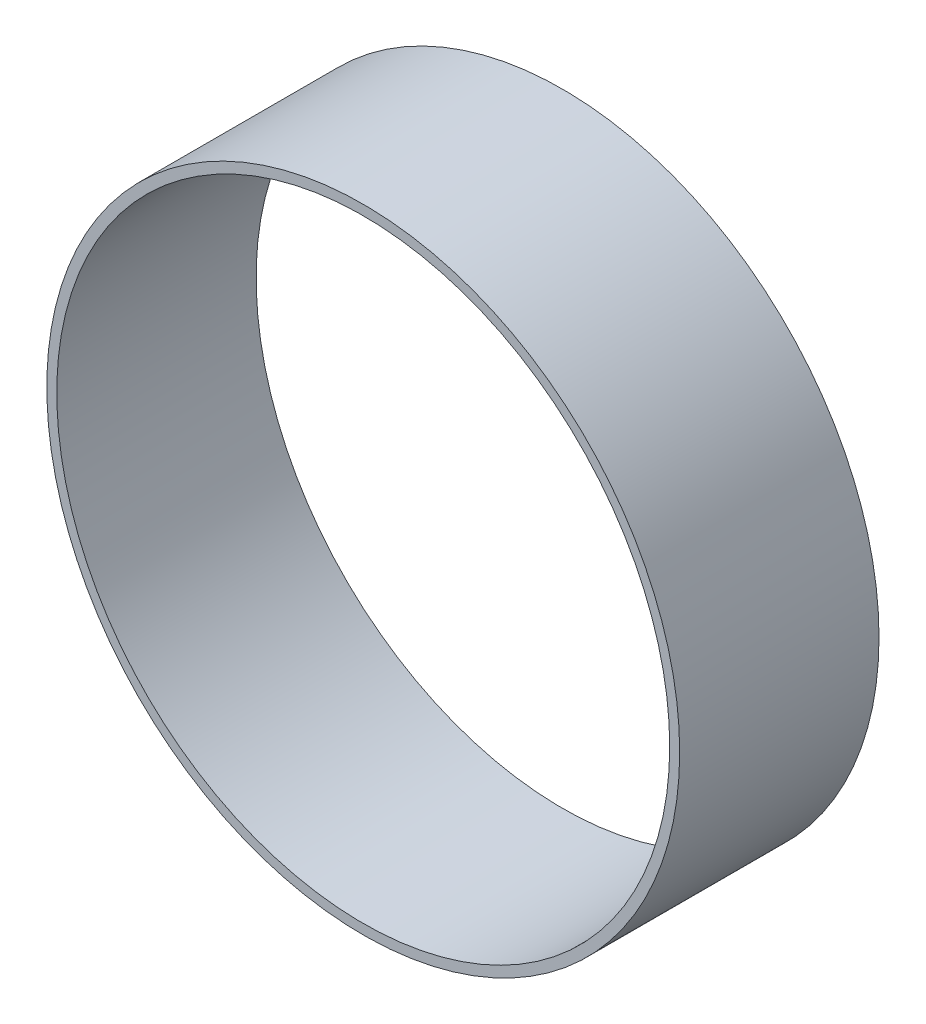
ISO-10303-21;
HEADER;
FILE_DESCRIPTION(('STEP AP214'),'2;1');
FILE_NAME('part.step','',(''),(''),'','','');
FILE_SCHEMA(('AUTOMOTIVE_DESIGN { 1 0 10303 214 1 1 1 1 }'));
ENDSEC;
DATA;
#1=APPLICATION_CONTEXT('core data for automotive mechanical design processes');
#2=APPLICATION_PROTOCOL_DEFINITION('international standard','automotive_design',2000,#1);
#3=PRODUCT_CONTEXT('',#1,'mechanical');
#4=PRODUCT('Part','Part','',(#3));
#5=PRODUCT_RELATED_PRODUCT_CATEGORY('part','',(#4));
#6=PRODUCT_DEFINITION_FORMATION('','',#4);
#7=PRODUCT_DEFINITION_CONTEXT('part definition',#1,'design');
#8=PRODUCT_DEFINITION('design','',#6,#7);
#9=PRODUCT_DEFINITION_SHAPE('','',#8);
#10=(LENGTH_UNIT() NAMED_UNIT(*) SI_UNIT(.MILLI.,.METRE.));
#11=(NAMED_UNIT(*) PLANE_ANGLE_UNIT() SI_UNIT($,.RADIAN.));
#12=(NAMED_UNIT(*) SI_UNIT($,.STERADIAN.) SOLID_ANGLE_UNIT());
#13=UNCERTAINTY_MEASURE_WITH_UNIT(LENGTH_MEASURE(1.E-05),#10,'distance_accuracy_value','');
#14=(GEOMETRIC_REPRESENTATION_CONTEXT(3) GLOBAL_UNCERTAINTY_ASSIGNED_CONTEXT((#13)) GLOBAL_UNIT_ASSIGNED_CONTEXT((#10,
#11,#12)) REPRESENTATION_CONTEXT('',''));
#15=CARTESIAN_POINT('',(0.,0.,0.));
#16=DIRECTION('',(0.,0.,1.));
#17=DIRECTION('',(1.,0.,0.));
#18=AXIS2_PLACEMENT_3D('',#15,#16,#17);
#19=CARTESIAN_POINT('',(0.,0.,40.));
#20=DIRECTION('',(0.,0.,1.));
#21=DIRECTION('',(1.,0.,0.));
#22=AXIS2_PLACEMENT_3D('',#19,#20,#21);
#23=PLANE('',#22);
#24=CARTESIAN_POINT('',(0.,0.,40.));
#25=DIRECTION('',(0.,0.,1.));
#26=DIRECTION('',(1.,0.,0.));
#27=AXIS2_PLACEMENT_3D('',#24,#25,#26);
#28=CIRCLE('',#27,63.5);
#29=CARTESIAN_POINT('',(63.5,0.,40.));
#30=VERTEX_POINT('',#29);
#31=EDGE_CURVE('E10',#30,#30,#28,.T.);
#32=ORIENTED_EDGE('',*,*,#31,.T.);
#33=EDGE_LOOP('',(#32));
#34=FACE_BOUND('',#33,.T.);
#35=CARTESIAN_POINT('',(0.,0.,40.));
#36=DIRECTION('',(0.,0.,1.));
#37=DIRECTION('',(1.,0.,0.));
#38=AXIS2_PLACEMENT_3D('',#35,#36,#37);
#39=CIRCLE('',#38,61.5);
#40=CARTESIAN_POINT('',(61.5,0.,40.));
#41=VERTEX_POINT('',#40);
#42=EDGE_CURVE('E44',#41,#41,#39,.T.);
#43=ORIENTED_EDGE('',*,*,#42,.F.);
#44=EDGE_LOOP('',(#43));
#45=FACE_BOUND('',#44,.T.);
#46=ADVANCED_FACE('F33',(#34,#45),#23,.T.);
#47=CARTESIAN_POINT('',(0.,0.,0.));
#48=DIRECTION('',(0.,0.,1.));
#49=DIRECTION('',(1.,0.,0.));
#50=AXIS2_PLACEMENT_3D('',#47,#48,#49);
#51=PLANE('',#50);
#52=CARTESIAN_POINT('',(0.,0.,0.));
#53=DIRECTION('',(0.,0.,1.));
#54=DIRECTION('',(1.,0.,0.));
#55=AXIS2_PLACEMENT_3D('',#52,#53,#54);
#56=CIRCLE('',#55,63.5);
#57=CARTESIAN_POINT('',(63.5,0.,0.));
#58=VERTEX_POINT('',#57);
#59=EDGE_CURVE('E37',#58,#58,#56,.T.);
#60=ORIENTED_EDGE('',*,*,#59,.F.);
#61=EDGE_LOOP('',(#60));
#62=FACE_BOUND('',#61,.T.);
#63=CARTESIAN_POINT('',(0.,0.,0.));
#64=DIRECTION('',(0.,0.,1.));
#65=DIRECTION('',(1.,0.,0.));
#66=AXIS2_PLACEMENT_3D('',#63,#64,#65);
#67=CIRCLE('',#66,61.5);
#68=CARTESIAN_POINT('',(61.5,0.,0.));
#69=VERTEX_POINT('',#68);
#70=EDGE_CURVE('E46',#69,#69,#67,.T.);
#71=ORIENTED_EDGE('',*,*,#70,.T.);
#72=EDGE_LOOP('',(#71));
#73=FACE_BOUND('',#72,.T.);
#74=ADVANCED_FACE('F56',(#62,#73),#51,.F.);
#75=CARTESIAN_POINT('',(0.,0.,40.));
#76=DIRECTION('',(0.,0.,-1.));
#77=DIRECTION('',(-1.,0.,0.));
#78=AXIS2_PLACEMENT_3D('',#75,#76,#77);
#79=CYLINDRICAL_SURFACE('',#78,63.5);
#80=ORIENTED_EDGE('',*,*,#31,.F.);
#81=EDGE_LOOP('',(#80));
#82=FACE_BOUND('',#81,.T.);
#83=ORIENTED_EDGE('',*,*,#59,.T.);
#84=EDGE_LOOP('',(#83));
#85=FACE_BOUND('',#84,.T.);
#86=ADVANCED_FACE('F35',(#82,#85),#79,.T.);
#87=CARTESIAN_POINT('',(0.,0.,40.));
#88=DIRECTION('',(0.,0.,-1.));
#89=DIRECTION('',(-1.,0.,0.));
#90=AXIS2_PLACEMENT_3D('',#87,#88,#89);
#91=CYLINDRICAL_SURFACE('',#90,61.5);
#92=ORIENTED_EDGE('',*,*,#42,.T.);
#93=EDGE_LOOP('',(#92));
#94=FACE_BOUND('',#93,.T.);
#95=ORIENTED_EDGE('',*,*,#70,.F.);
#96=EDGE_LOOP('',(#95));
#97=FACE_BOUND('',#96,.T.);
#98=ADVANCED_FACE('F52',(#94,#97),#91,.F.);
#99=CLOSED_SHELL('',(#46,#74,#86,#98));
#100=MANIFOLD_SOLID_BREP('B2',#99);
#101=ADVANCED_BREP_SHAPE_REPRESENTATION('',(#18,#100),#14);
#102=SHAPE_DEFINITION_REPRESENTATION(#9,#101);
ENDSEC;
END-ISO-10303-21;
